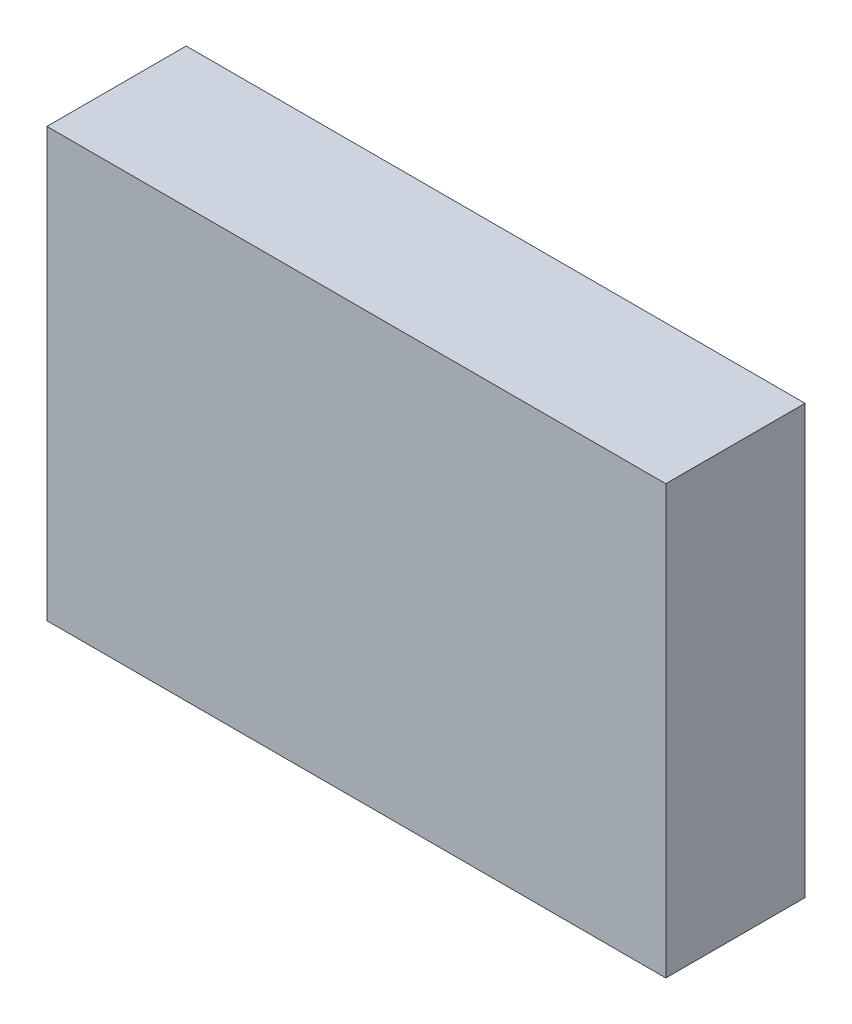
ISO-10303-21;
HEADER;
FILE_DESCRIPTION(('STEP AP214'),'2;1');
FILE_NAME('part.step','',(''),(''),'','','');
FILE_SCHEMA(('AUTOMOTIVE_DESIGN { 1 0 10303 214 1 1 1 1 }'));
ENDSEC;
DATA;
#1=APPLICATION_CONTEXT('core data for automotive mechanical design processes');
#2=APPLICATION_PROTOCOL_DEFINITION('international standard','automotive_design',2000,#1);
#3=PRODUCT_CONTEXT('',#1,'mechanical');
#4=PRODUCT('Part','Part','',(#3));
#5=PRODUCT_RELATED_PRODUCT_CATEGORY('part','',(#4));
#6=PRODUCT_DEFINITION_FORMATION('','',#4);
#7=PRODUCT_DEFINITION_CONTEXT('part definition',#1,'design');
#8=PRODUCT_DEFINITION('design','',#6,#7);
#9=PRODUCT_DEFINITION_SHAPE('','',#8);
#10=(LENGTH_UNIT() NAMED_UNIT(*) SI_UNIT(.MILLI.,.METRE.));
#11=(NAMED_UNIT(*) PLANE_ANGLE_UNIT() SI_UNIT($,.RADIAN.));
#12=(NAMED_UNIT(*) SI_UNIT($,.STERADIAN.) SOLID_ANGLE_UNIT());
#13=UNCERTAINTY_MEASURE_WITH_UNIT(LENGTH_MEASURE(1.E-05),#10,'distance_accuracy_value','');
#14=(GEOMETRIC_REPRESENTATION_CONTEXT(3) GLOBAL_UNCERTAINTY_ASSIGNED_CONTEXT((#13)) GLOBAL_UNIT_ASSIGNED_CONTEXT((#10,
#11,#12)) REPRESENTATION_CONTEXT('',''));
#15=CARTESIAN_POINT('',(0.,0.,0.));
#16=DIRECTION('',(0.,0.,1.));
#17=DIRECTION('',(1.,0.,0.));
#18=AXIS2_PLACEMENT_3D('',#15,#16,#17);
#19=CARTESIAN_POINT('',(0.,0.,27.));
#20=DIRECTION('',(1.,0.,0.));
#21=DIRECTION('',(0.,0.,-1.));
#22=AXIS2_PLACEMENT_3D('',#19,#20,#21);
#23=PLANE('',#22);
#24=DIRECTION('',(0.,-1.,0.));
#25=VECTOR('',#24,1.);
#26=CARTESIAN_POINT('',(0.,0.,0.));
#27=LINE('',#26,#25);
#28=CARTESIAN_POINT('',(0.,83.,0.));
#29=VERTEX_POINT('',#28);
#30=CARTESIAN_POINT('',(0.,0.,0.));
#31=VERTEX_POINT('',#30);
#32=EDGE_CURVE('E102',#29,#31,#27,.T.);
#33=ORIENTED_EDGE('',*,*,#32,.T.);
#34=DIRECTION('',(0.,0.,-1.));
#35=VECTOR('',#34,1.);
#36=CARTESIAN_POINT('',(0.,0.,27.));
#37=LINE('',#36,#35);
#38=CARTESIAN_POINT('',(0.,0.,27.));
#39=VERTEX_POINT('',#38);
#40=EDGE_CURVE('E11',#39,#31,#37,.T.);
#41=ORIENTED_EDGE('',*,*,#40,.F.);
#42=DIRECTION('',(0.,-1.,0.));
#43=VECTOR('',#42,1.);
#44=CARTESIAN_POINT('',(0.,0.,27.));
#45=LINE('',#44,#43);
#46=CARTESIAN_POINT('',(0.,83.,27.));
#47=VERTEX_POINT('',#46);
#48=EDGE_CURVE('E90',#47,#39,#45,.T.);
#49=ORIENTED_EDGE('',*,*,#48,.F.);
#50=DIRECTION('',(0.,0.,-1.));
#51=VECTOR('',#50,1.);
#52=CARTESIAN_POINT('',(0.,83.,27.));
#53=LINE('',#52,#51);
#54=EDGE_CURVE('E98',#47,#29,#53,.T.);
#55=ORIENTED_EDGE('',*,*,#54,.T.);
#56=EDGE_LOOP('',(#33,#41,#49,#55));
#57=FACE_BOUND('',#56,.T.);
#58=ADVANCED_FACE('F39',(#57),#23,.F.);
#59=CARTESIAN_POINT('',(0.,0.,27.));
#60=DIRECTION('',(0.,1.,0.));
#61=DIRECTION('',(0.,0.,1.));
#62=AXIS2_PLACEMENT_3D('',#59,#60,#61);
#63=PLANE('',#62);
#64=DIRECTION('',(1.,0.,0.));
#65=VECTOR('',#64,1.);
#66=CARTESIAN_POINT('',(0.,0.,0.));
#67=LINE('',#66,#65);
#68=CARTESIAN_POINT('',(120.,0.,0.));
#69=VERTEX_POINT('',#68);
#70=EDGE_CURVE('E94',#31,#69,#67,.T.);
#71=ORIENTED_EDGE('',*,*,#70,.T.);
#72=DIRECTION('',(0.,0.,-1.));
#73=VECTOR('',#72,1.);
#74=CARTESIAN_POINT('',(120.,0.,27.));
#75=LINE('',#74,#73);
#76=CARTESIAN_POINT('',(120.,0.,27.));
#77=VERTEX_POINT('',#76);
#78=EDGE_CURVE('E47',#77,#69,#75,.T.);
#79=ORIENTED_EDGE('',*,*,#78,.F.);
#80=DIRECTION('',(1.,0.,0.));
#81=VECTOR('',#80,1.);
#82=CARTESIAN_POINT('',(0.,0.,27.));
#83=LINE('',#82,#81);
#84=EDGE_CURVE('E85',#39,#77,#83,.T.);
#85=ORIENTED_EDGE('',*,*,#84,.F.);
#86=ORIENTED_EDGE('',*,*,#40,.T.);
#87=EDGE_LOOP('',(#71,#79,#85,#86));
#88=FACE_BOUND('',#87,.T.);
#89=ADVANCED_FACE('F93',(#88),#63,.F.);
#90=CARTESIAN_POINT('',(120.,0.,27.));
#91=DIRECTION('',(-1.,0.,0.));
#92=DIRECTION('',(0.,0.,1.));
#93=AXIS2_PLACEMENT_3D('',#90,#91,#92);
#94=PLANE('',#93);
#95=DIRECTION('',(0.,1.,0.));
#96=VECTOR('',#95,1.);
#97=CARTESIAN_POINT('',(120.,0.,0.));
#98=LINE('',#97,#96);
#99=CARTESIAN_POINT('',(120.,83.,0.));
#100=VERTEX_POINT('',#99);
#101=EDGE_CURVE('E72',#69,#100,#98,.T.);
#102=ORIENTED_EDGE('',*,*,#101,.T.);
#103=DIRECTION('',(0.,0.,-1.));
#104=VECTOR('',#103,1.);
#105=CARTESIAN_POINT('',(120.,83.,27.));
#106=LINE('',#105,#104);
#107=CARTESIAN_POINT('',(120.,83.,27.));
#108=VERTEX_POINT('',#107);
#109=EDGE_CURVE('E95',#108,#100,#106,.T.);
#110=ORIENTED_EDGE('',*,*,#109,.F.);
#111=DIRECTION('',(0.,1.,0.));
#112=VECTOR('',#111,1.);
#113=CARTESIAN_POINT('',(120.,0.,27.));
#114=LINE('',#113,#112);
#115=EDGE_CURVE('E88',#77,#108,#114,.T.);
#116=ORIENTED_EDGE('',*,*,#115,.F.);
#117=ORIENTED_EDGE('',*,*,#78,.T.);
#118=EDGE_LOOP('',(#102,#110,#116,#117));
#119=FACE_BOUND('',#118,.T.);
#120=ADVANCED_FACE('F96',(#119),#94,.F.);
#121=CARTESIAN_POINT('',(0.,83.,27.));
#122=DIRECTION('',(0.,-1.,0.));
#123=DIRECTION('',(0.,0.,-1.));
#124=AXIS2_PLACEMENT_3D('',#121,#122,#123);
#125=PLANE('',#124);
#126=DIRECTION('',(-1.,0.,0.));
#127=VECTOR('',#126,1.);
#128=CARTESIAN_POINT('',(0.,83.,0.));
#129=LINE('',#128,#127);
#130=EDGE_CURVE('E78',#100,#29,#129,.T.);
#131=ORIENTED_EDGE('',*,*,#130,.T.);
#132=ORIENTED_EDGE('',*,*,#54,.F.);
#133=DIRECTION('',(-1.,0.,0.));
#134=VECTOR('',#133,1.);
#135=CARTESIAN_POINT('',(0.,83.,27.));
#136=LINE('',#135,#134);
#137=EDGE_CURVE('E55',#108,#47,#136,.T.);
#138=ORIENTED_EDGE('',*,*,#137,.F.);
#139=ORIENTED_EDGE('',*,*,#109,.T.);
#140=EDGE_LOOP('',(#131,#132,#138,#139));
#141=FACE_BOUND('',#140,.T.);
#142=ADVANCED_FACE('F109',(#141),#125,.F.);
#143=CARTESIAN_POINT('',(0.,0.,27.));
#144=DIRECTION('',(0.,0.,-1.));
#145=DIRECTION('',(-1.,0.,0.));
#146=AXIS2_PLACEMENT_3D('',#143,#144,#145);
#147=PLANE('',#146);
#148=ORIENTED_EDGE('',*,*,#48,.T.);
#149=ORIENTED_EDGE('',*,*,#84,.T.);
#150=ORIENTED_EDGE('',*,*,#115,.T.);
#151=ORIENTED_EDGE('',*,*,#137,.T.);
#152=EDGE_LOOP('',(#148,#149,#150,#151));
#153=FACE_BOUND('',#152,.T.);
#154=ADVANCED_FACE('F86',(#153),#147,.F.);
#155=CARTESIAN_POINT('',(0.,0.,0.));
#156=DIRECTION('',(0.,0.,-1.));
#157=DIRECTION('',(-1.,0.,0.));
#158=AXIS2_PLACEMENT_3D('',#155,#156,#157);
#159=PLANE('',#158);
#160=ORIENTED_EDGE('',*,*,#32,.F.);
#161=ORIENTED_EDGE('',*,*,#130,.F.);
#162=ORIENTED_EDGE('',*,*,#101,.F.);
#163=ORIENTED_EDGE('',*,*,#70,.F.);
#164=EDGE_LOOP('',(#160,#161,#162,#163));
#165=FACE_BOUND('',#164,.T.);
#166=ADVANCED_FACE('F112',(#165),#159,.T.);
#167=CLOSED_SHELL('',(#58,#89,#120,#142,#154,#166));
#168=MANIFOLD_SOLID_BREP('B2',#167);
#169=ADVANCED_BREP_SHAPE_REPRESENTATION('',(#18,#168),#14);
#170=SHAPE_DEFINITION_REPRESENTATION(#9,#169);
ENDSEC;
END-ISO-10303-21;
